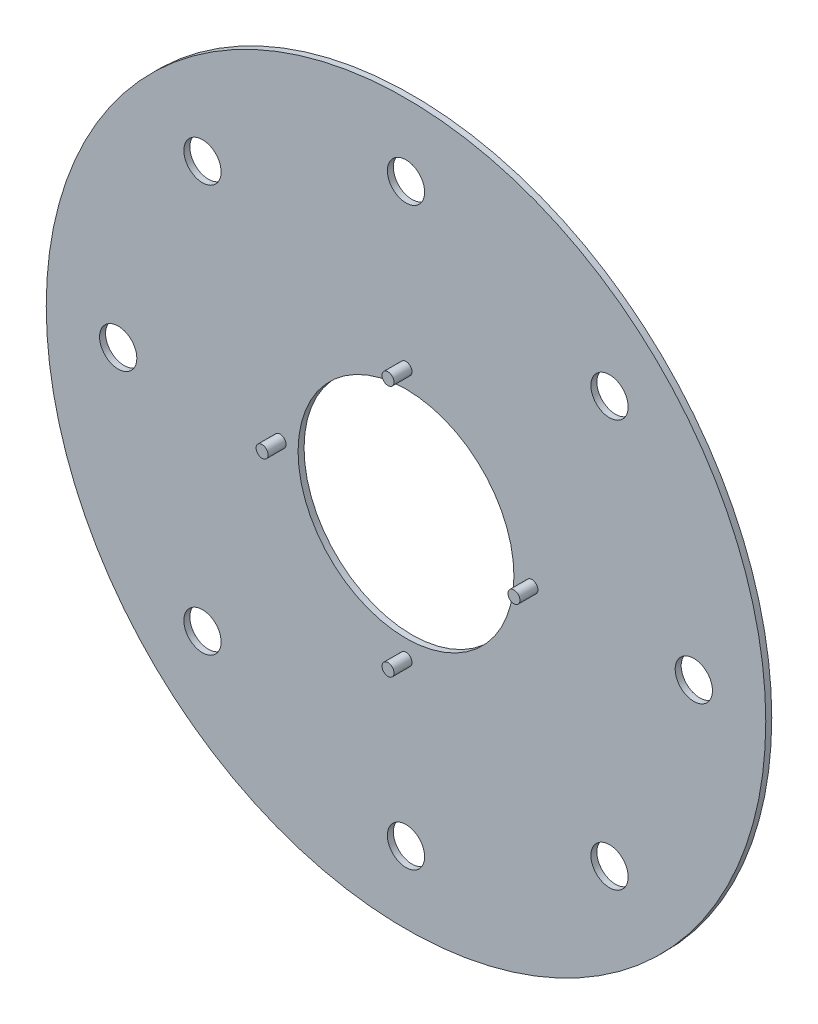
ISO-10303-21;
HEADER;
FILE_DESCRIPTION(('STEP AP214'),'2;1');
FILE_NAME('part.step','',(''),(''),'','','');
FILE_SCHEMA(('AUTOMOTIVE_DESIGN { 1 0 10303 214 1 1 1 1 }'));
ENDSEC;
DATA;
#1=APPLICATION_CONTEXT('core data for automotive mechanical design processes');
#2=APPLICATION_PROTOCOL_DEFINITION('international standard','automotive_design',2000,#1);
#3=PRODUCT_CONTEXT('',#1,'mechanical');
#4=PRODUCT('Part','Part','',(#3));
#5=PRODUCT_RELATED_PRODUCT_CATEGORY('part','',(#4));
#6=PRODUCT_DEFINITION_FORMATION('','',#4);
#7=PRODUCT_DEFINITION_CONTEXT('part definition',#1,'design');
#8=PRODUCT_DEFINITION('design','',#6,#7);
#9=PRODUCT_DEFINITION_SHAPE('','',#8);
#10=(LENGTH_UNIT() NAMED_UNIT(*) SI_UNIT(.MILLI.,.METRE.));
#11=(NAMED_UNIT(*) PLANE_ANGLE_UNIT() SI_UNIT($,.RADIAN.));
#12=(NAMED_UNIT(*) SI_UNIT($,.STERADIAN.) SOLID_ANGLE_UNIT());
#13=UNCERTAINTY_MEASURE_WITH_UNIT(LENGTH_MEASURE(1.E-05),#10,'distance_accuracy_value','');
#14=(GEOMETRIC_REPRESENTATION_CONTEXT(3) GLOBAL_UNCERTAINTY_ASSIGNED_CONTEXT((#13)) GLOBAL_UNIT_ASSIGNED_CONTEXT((#10,
#11,#12)) REPRESENTATION_CONTEXT('',''));
#15=CARTESIAN_POINT('',(0.,0.,0.));
#16=DIRECTION('',(0.,0.,1.));
#17=DIRECTION('',(1.,0.,0.));
#18=AXIS2_PLACEMENT_3D('',#15,#16,#17);
#19=CARTESIAN_POINT('',(0.,0.,1.));
#20=DIRECTION('',(0.,0.,1.));
#21=DIRECTION('',(1.,0.,0.));
#22=AXIS2_PLACEMENT_3D('',#19,#20,#21);
#23=PLANE('',#22);
#24=CARTESIAN_POINT('',(0.,0.,1.));
#25=DIRECTION('',(0.,0.,1.));
#26=DIRECTION('',(1.,0.,0.));
#27=AXIS2_PLACEMENT_3D('',#24,#25,#26);
#28=CIRCLE('',#27,18.);
#29=CARTESIAN_POINT('',(18.,0.,1.));
#30=VERTEX_POINT('',#29);
#31=EDGE_CURVE('E152',#30,#30,#28,.T.);
#32=ORIENTED_EDGE('',*,*,#31,.F.);
#33=EDGE_LOOP('',(#32));
#34=FACE_BOUND('',#33,.T.);
#35=CARTESIAN_POINT('',(-20.9999999999994,-5.95570018899379E-13,1.));
#36=DIRECTION('',(0.,0.,1.));
#37=DIRECTION('',(1.,0.,0.));
#38=AXIS2_PLACEMENT_3D('',#35,#36,#37);
#39=CIRCLE('',#38,1.00000000000095);
#40=CARTESIAN_POINT('',(-19.9999999999985,-5.95570018899379E-13,1.));
#41=VERTEX_POINT('',#40);
#42=EDGE_CURVE('E141',#41,#41,#39,.T.);
#43=ORIENTED_EDGE('',*,*,#42,.F.);
#44=EDGE_LOOP('',(#43));
#45=FACE_BOUND('',#44,.T.);
#46=CARTESIAN_POINT('',(1.18599652124234E-12,-21.,1.));
#47=DIRECTION('',(0.,0.,1.));
#48=DIRECTION('',(1.,0.,0.));
#49=AXIS2_PLACEMENT_3D('',#46,#47,#48);
#50=CIRCLE('',#49,1.00000000000127);
#51=CARTESIAN_POINT('',(1.00000000000246,-21.,1.));
#52=VERTEX_POINT('',#51);
#53=EDGE_CURVE('E133',#52,#52,#50,.T.);
#54=ORIENTED_EDGE('',*,*,#53,.F.);
#55=EDGE_LOOP('',(#54));
#56=FACE_BOUND('',#55,.T.);
#57=CARTESIAN_POINT('',(21.0000000000006,5.9299826062117E-13,1.));
#58=DIRECTION('',(0.,0.,1.));
#59=DIRECTION('',(1.,0.,0.));
#60=AXIS2_PLACEMENT_3D('',#57,#58,#59);
#61=CIRCLE('',#60,1.00000000000047);
#62=CARTESIAN_POINT('',(22.0000000000011,5.9299826062117E-13,1.));
#63=VERTEX_POINT('',#62);
#64=EDGE_CURVE('E125',#63,#63,#61,.T.);
#65=ORIENTED_EDGE('',*,*,#64,.F.);
#66=EDGE_LOOP('',(#65));
#67=FACE_BOUND('',#66,.T.);
#68=CARTESIAN_POINT('',(0.,21.,1.));
#69=DIRECTION('',(0.,0.,1.));
#70=DIRECTION('',(1.,0.,0.));
#71=AXIS2_PLACEMENT_3D('',#68,#69,#70);
#72=CIRCLE('',#71,1.);
#73=CARTESIAN_POINT('',(1.,21.,1.));
#74=VERTEX_POINT('',#73);
#75=EDGE_CURVE('E121',#74,#74,#72,.T.);
#76=ORIENTED_EDGE('',*,*,#75,.F.);
#77=EDGE_LOOP('',(#76));
#78=FACE_BOUND('',#77,.T.);
#79=CARTESIAN_POINT('',(-47.999999999998,-2.04342392667114E-12,1.));
#80=DIRECTION('',(0.,0.,1.));
#81=DIRECTION('',(1.,0.,0.));
#82=AXIS2_PLACEMENT_3D('',#79,#80,#81);
#83=CIRCLE('',#82,3.10719487491723);
#84=CARTESIAN_POINT('',(-44.8928051250807,-2.04342392667114E-12,1.));
#85=VERTEX_POINT('',#84);
#86=EDGE_CURVE('E101',#85,#85,#83,.T.);
#87=ORIENTED_EDGE('',*,*,#86,.F.);
#88=EDGE_LOOP('',(#87));
#89=FACE_BOUND('',#88,.T.);
#90=CARTESIAN_POINT('',(4.07509124407046E-12,-48.,1.));
#91=DIRECTION('',(0.,0.,1.));
#92=DIRECTION('',(1.,0.,0.));
#93=AXIS2_PLACEMENT_3D('',#90,#91,#92);
#94=CIRCLE('',#93,3.10719487491842);
#95=CARTESIAN_POINT('',(3.10719487492249,-48.,1.));
#96=VERTEX_POINT('',#95);
#97=EDGE_CURVE('E85',#96,#96,#94,.T.);
#98=ORIENTED_EDGE('',*,*,#97,.F.);
#99=EDGE_LOOP('',(#98));
#100=FACE_BOUND('',#99,.T.);
#101=CARTESIAN_POINT('',(48.000000000002,2.03754562203523E-12,1.));
#102=DIRECTION('',(0.,0.,1.));
#103=DIRECTION('',(1.,0.,0.));
#104=AXIS2_PLACEMENT_3D('',#101,#102,#103);
#105=CIRCLE('',#104,3.10719487491572);
#106=CARTESIAN_POINT('',(51.1071948749178,2.03754562203523E-12,1.));
#107=VERTEX_POINT('',#106);
#108=EDGE_CURVE('E69',#107,#107,#105,.T.);
#109=ORIENTED_EDGE('',*,*,#108,.F.);
#110=EDGE_LOOP('',(#109));
#111=FACE_BOUND('',#110,.T.);
#112=CARTESIAN_POINT('',(0.,48.,1.));
#113=DIRECTION('',(0.,0.,1.));
#114=DIRECTION('',(1.,0.,0.));
#115=AXIS2_PLACEMENT_3D('',#112,#113,#114);
#116=CIRCLE('',#115,3.1071948749142);
#117=CARTESIAN_POINT('',(3.1071948749142,48.,1.));
#118=VERTEX_POINT('',#117);
#119=EDGE_CURVE('E55',#118,#118,#116,.T.);
#120=ORIENTED_EDGE('',*,*,#119,.F.);
#121=EDGE_LOOP('',(#120));
#122=FACE_BOUND('',#121,.T.);
#123=CARTESIAN_POINT('',(0.,0.,1.));
#124=DIRECTION('',(0.,0.,1.));
#125=DIRECTION('',(1.,0.,0.));
#126=AXIS2_PLACEMENT_3D('',#123,#124,#125);
#127=CIRCLE('',#126,60.);
#128=CARTESIAN_POINT('',(60.,0.,1.));
#129=VERTEX_POINT('',#128);
#130=EDGE_CURVE('E10',#129,#129,#127,.T.);
#131=ORIENTED_EDGE('',*,*,#130,.T.);
#132=EDGE_LOOP('',(#131));
#133=FACE_BOUND('',#132,.T.);
#134=CARTESIAN_POINT('',(33.9411254969549,33.9411254969557,1.));
#135=DIRECTION('',(0.,0.,1.));
#136=DIRECTION('',(1.,0.,0.));
#137=AXIS2_PLACEMENT_3D('',#134,#135,#136);
#138=CIRCLE('',#137,3.10719487491444);
#139=CARTESIAN_POINT('',(37.0483203718693,33.9411254969557,1.));
#140=VERTEX_POINT('',#139);
#141=EDGE_CURVE('E61',#140,#140,#138,.T.);
#142=ORIENTED_EDGE('',*,*,#141,.F.);
#143=EDGE_LOOP('',(#142));
#144=FACE_BOUND('',#143,.T.);
#145=CARTESIAN_POINT('',(33.9411254969578,-33.9411254969528,1.));
#146=DIRECTION('',(0.,0.,1.));
#147=DIRECTION('',(1.,0.,0.));
#148=AXIS2_PLACEMENT_3D('',#145,#146,#147);
#149=CIRCLE('',#148,3.10719487491734);
#150=CARTESIAN_POINT('',(37.0483203718751,-33.9411254969528,1.));
#151=VERTEX_POINT('',#150);
#152=EDGE_CURVE('E77',#151,#151,#149,.T.);
#153=ORIENTED_EDGE('',*,*,#152,.F.);
#154=EDGE_LOOP('',(#153));
#155=FACE_BOUND('',#154,.T.);
#156=CARTESIAN_POINT('',(-33.9411254969508,-33.9411254969557,1.));
#157=DIRECTION('',(0.,0.,1.));
#158=DIRECTION('',(1.,0.,0.));
#159=AXIS2_PLACEMENT_3D('',#156,#157,#158);
#160=CIRCLE('',#159,3.10719487491836);
#161=CARTESIAN_POINT('',(-30.8339306220324,-33.9411254969557,1.));
#162=VERTEX_POINT('',#161);
#163=EDGE_CURVE('E93',#162,#162,#160,.T.);
#164=ORIENTED_EDGE('',*,*,#163,.F.);
#165=EDGE_LOOP('',(#164));
#166=FACE_BOUND('',#165,.T.);
#167=CARTESIAN_POINT('',(-33.9411254969537,33.9411254969528,1.));
#168=DIRECTION('',(0.,0.,1.));
#169=DIRECTION('',(1.,0.,0.));
#170=AXIS2_PLACEMENT_3D('',#167,#168,#169);
#171=CIRCLE('',#170,3.10719487491576);
#172=CARTESIAN_POINT('',(-30.8339306220379,33.9411254969528,1.));
#173=VERTEX_POINT('',#172);
#174=EDGE_CURVE('E109',#173,#173,#171,.T.);
#175=ORIENTED_EDGE('',*,*,#174,.F.);
#176=EDGE_LOOP('',(#175));
#177=FACE_BOUND('',#176,.T.);
#178=ADVANCED_FACE('F40',(#34,#45,#56,#67,#78,#89,#100,#111,#122,#133,#144,#155,#166,#177),#23,.T.);
#179=CARTESIAN_POINT('',(0.,0.,0.));
#180=DIRECTION('',(0.,0.,1.));
#181=DIRECTION('',(1.,0.,0.));
#182=AXIS2_PLACEMENT_3D('',#179,#180,#181);
#183=PLANE('',#182);
#184=CARTESIAN_POINT('',(0.,0.,0.));
#185=DIRECTION('',(0.,0.,1.));
#186=DIRECTION('',(1.,0.,0.));
#187=AXIS2_PLACEMENT_3D('',#184,#185,#186);
#188=CIRCLE('',#187,18.);
#189=CARTESIAN_POINT('',(18.,0.,0.));
#190=VERTEX_POINT('',#189);
#191=EDGE_CURVE('E44',#190,#190,#188,.T.);
#192=ORIENTED_EDGE('',*,*,#191,.T.);
#193=EDGE_LOOP('',(#192));
#194=FACE_BOUND('',#193,.T.);
#195=CARTESIAN_POINT('',(0.,0.,0.));
#196=DIRECTION('',(0.,0.,1.));
#197=DIRECTION('',(1.,0.,0.));
#198=AXIS2_PLACEMENT_3D('',#195,#196,#197);
#199=CIRCLE('',#198,60.);
#200=CARTESIAN_POINT('',(60.,0.,0.));
#201=VERTEX_POINT('',#200);
#202=EDGE_CURVE('E49',#201,#201,#199,.T.);
#203=ORIENTED_EDGE('',*,*,#202,.F.);
#204=EDGE_LOOP('',(#203));
#205=FACE_BOUND('',#204,.T.);
#206=CARTESIAN_POINT('',(0.,48.,0.));
#207=DIRECTION('',(0.,0.,1.));
#208=DIRECTION('',(1.,0.,0.));
#209=AXIS2_PLACEMENT_3D('',#206,#207,#208);
#210=CIRCLE('',#209,3.1071948749142);
#211=CARTESIAN_POINT('',(3.1071948749142,48.,0.));
#212=VERTEX_POINT('',#211);
#213=EDGE_CURVE('E57',#212,#212,#210,.T.);
#214=ORIENTED_EDGE('',*,*,#213,.T.);
#215=EDGE_LOOP('',(#214));
#216=FACE_BOUND('',#215,.T.);
#217=CARTESIAN_POINT('',(33.9411254969549,33.9411254969557,0.));
#218=DIRECTION('',(0.,0.,1.));
#219=DIRECTION('',(1.,0.,0.));
#220=AXIS2_PLACEMENT_3D('',#217,#218,#219);
#221=CIRCLE('',#220,3.10719487491444);
#222=CARTESIAN_POINT('',(37.0483203718693,33.9411254969557,0.));
#223=VERTEX_POINT('',#222);
#224=EDGE_CURVE('E65',#223,#223,#221,.T.);
#225=ORIENTED_EDGE('',*,*,#224,.T.);
#226=EDGE_LOOP('',(#225));
#227=FACE_BOUND('',#226,.T.);
#228=CARTESIAN_POINT('',(48.000000000002,2.03754562203523E-12,0.));
#229=DIRECTION('',(0.,0.,1.));
#230=DIRECTION('',(1.,0.,0.));
#231=AXIS2_PLACEMENT_3D('',#228,#229,#230);
#232=CIRCLE('',#231,3.10719487491572);
#233=CARTESIAN_POINT('',(51.1071948749178,2.03754562203523E-12,0.));
#234=VERTEX_POINT('',#233);
#235=EDGE_CURVE('E73',#234,#234,#232,.T.);
#236=ORIENTED_EDGE('',*,*,#235,.T.);
#237=EDGE_LOOP('',(#236));
#238=FACE_BOUND('',#237,.T.);
#239=CARTESIAN_POINT('',(33.9411254969578,-33.9411254969528,0.));
#240=DIRECTION('',(0.,0.,1.));
#241=DIRECTION('',(1.,0.,0.));
#242=AXIS2_PLACEMENT_3D('',#239,#240,#241);
#243=CIRCLE('',#242,3.10719487491734);
#244=CARTESIAN_POINT('',(37.0483203718751,-33.9411254969528,0.));
#245=VERTEX_POINT('',#244);
#246=EDGE_CURVE('E81',#245,#245,#243,.T.);
#247=ORIENTED_EDGE('',*,*,#246,.T.);
#248=EDGE_LOOP('',(#247));
#249=FACE_BOUND('',#248,.T.);
#250=CARTESIAN_POINT('',(4.07509124407046E-12,-48.,0.));
#251=DIRECTION('',(0.,0.,1.));
#252=DIRECTION('',(1.,0.,0.));
#253=AXIS2_PLACEMENT_3D('',#250,#251,#252);
#254=CIRCLE('',#253,3.10719487491842);
#255=CARTESIAN_POINT('',(3.10719487492249,-48.,0.));
#256=VERTEX_POINT('',#255);
#257=EDGE_CURVE('E89',#256,#256,#254,.T.);
#258=ORIENTED_EDGE('',*,*,#257,.T.);
#259=EDGE_LOOP('',(#258));
#260=FACE_BOUND('',#259,.T.);
#261=CARTESIAN_POINT('',(-33.9411254969508,-33.9411254969557,0.));
#262=DIRECTION('',(0.,0.,1.));
#263=DIRECTION('',(1.,0.,0.));
#264=AXIS2_PLACEMENT_3D('',#261,#262,#263);
#265=CIRCLE('',#264,3.10719487491836);
#266=CARTESIAN_POINT('',(-30.8339306220324,-33.9411254969557,0.));
#267=VERTEX_POINT('',#266);
#268=EDGE_CURVE('E97',#267,#267,#265,.T.);
#269=ORIENTED_EDGE('',*,*,#268,.T.);
#270=EDGE_LOOP('',(#269));
#271=FACE_BOUND('',#270,.T.);
#272=CARTESIAN_POINT('',(-47.999999999998,-2.04342392667114E-12,0.));
#273=DIRECTION('',(0.,0.,1.));
#274=DIRECTION('',(1.,0.,0.));
#275=AXIS2_PLACEMENT_3D('',#272,#273,#274);
#276=CIRCLE('',#275,3.10719487491723);
#277=CARTESIAN_POINT('',(-44.8928051250807,-2.04342392667114E-12,0.));
#278=VERTEX_POINT('',#277);
#279=EDGE_CURVE('E105',#278,#278,#276,.T.);
#280=ORIENTED_EDGE('',*,*,#279,.T.);
#281=EDGE_LOOP('',(#280));
#282=FACE_BOUND('',#281,.T.);
#283=CARTESIAN_POINT('',(-33.9411254969537,33.9411254969528,0.));
#284=DIRECTION('',(0.,0.,1.));
#285=DIRECTION('',(1.,0.,0.));
#286=AXIS2_PLACEMENT_3D('',#283,#284,#285);
#287=CIRCLE('',#286,3.10719487491576);
#288=CARTESIAN_POINT('',(-30.8339306220379,33.9411254969528,0.));
#289=VERTEX_POINT('',#288);
#290=EDGE_CURVE('E113',#289,#289,#287,.T.);
#291=ORIENTED_EDGE('',*,*,#290,.T.);
#292=EDGE_LOOP('',(#291));
#293=FACE_BOUND('',#292,.T.);
#294=ADVANCED_FACE('F161',(#194,#205,#216,#227,#238,#249,#260,#271,#282,#293),#183,.F.);
#295=CARTESIAN_POINT('',(0.,0.,1.));
#296=DIRECTION('',(0.,0.,-1.));
#297=DIRECTION('',(-1.,0.,0.));
#298=AXIS2_PLACEMENT_3D('',#295,#296,#297);
#299=CYLINDRICAL_SURFACE('',#298,60.);
#300=ORIENTED_EDGE('',*,*,#130,.F.);
#301=EDGE_LOOP('',(#300));
#302=FACE_BOUND('',#301,.T.);
#303=ORIENTED_EDGE('',*,*,#202,.T.);
#304=EDGE_LOOP('',(#303));
#305=FACE_BOUND('',#304,.T.);
#306=ADVANCED_FACE('F42',(#302,#305),#299,.T.);
#307=CARTESIAN_POINT('',(0.,48.,1.));
#308=DIRECTION('',(0.,0.,-1.));
#309=DIRECTION('',(-1.,0.,0.));
#310=AXIS2_PLACEMENT_3D('',#307,#308,#309);
#311=CYLINDRICAL_SURFACE('',#310,3.1071948749142);
#312=ORIENTED_EDGE('',*,*,#119,.T.);
#313=EDGE_LOOP('',(#312));
#314=FACE_BOUND('',#313,.T.);
#315=ORIENTED_EDGE('',*,*,#213,.F.);
#316=EDGE_LOOP('',(#315));
#317=FACE_BOUND('',#316,.T.);
#318=ADVANCED_FACE('F184',(#314,#317),#311,.F.);
#319=CARTESIAN_POINT('',(33.9411254969549,33.9411254969557,1.));
#320=DIRECTION('',(0.,0.,-1.));
#321=DIRECTION('',(-1.,0.,0.));
#322=AXIS2_PLACEMENT_3D('',#319,#320,#321);
#323=CYLINDRICAL_SURFACE('',#322,3.10719487491444);
#324=ORIENTED_EDGE('',*,*,#141,.T.);
#325=EDGE_LOOP('',(#324));
#326=FACE_BOUND('',#325,.T.);
#327=ORIENTED_EDGE('',*,*,#224,.F.);
#328=EDGE_LOOP('',(#327));
#329=FACE_BOUND('',#328,.T.);
#330=ADVANCED_FACE('F187',(#326,#329),#323,.F.);
#331=CARTESIAN_POINT('',(48.000000000002,2.03754562203523E-12,1.));
#332=DIRECTION('',(0.,0.,-1.));
#333=DIRECTION('',(-1.,0.,0.));
#334=AXIS2_PLACEMENT_3D('',#331,#332,#333);
#335=CYLINDRICAL_SURFACE('',#334,3.10719487491572);
#336=ORIENTED_EDGE('',*,*,#108,.T.);
#337=EDGE_LOOP('',(#336));
#338=FACE_BOUND('',#337,.T.);
#339=ORIENTED_EDGE('',*,*,#235,.F.);
#340=EDGE_LOOP('',(#339));
#341=FACE_BOUND('',#340,.T.);
#342=ADVANCED_FACE('F191',(#338,#341),#335,.F.);
#343=CARTESIAN_POINT('',(33.9411254969578,-33.9411254969528,1.));
#344=DIRECTION('',(0.,0.,-1.));
#345=DIRECTION('',(-1.,0.,0.));
#346=AXIS2_PLACEMENT_3D('',#343,#344,#345);
#347=CYLINDRICAL_SURFACE('',#346,3.10719487491734);
#348=ORIENTED_EDGE('',*,*,#152,.T.);
#349=EDGE_LOOP('',(#348));
#350=FACE_BOUND('',#349,.T.);
#351=ORIENTED_EDGE('',*,*,#246,.F.);
#352=EDGE_LOOP('',(#351));
#353=FACE_BOUND('',#352,.T.);
#354=ADVANCED_FACE('F195',(#350,#353),#347,.F.);
#355=CARTESIAN_POINT('',(4.07509124407046E-12,-48.,1.));
#356=DIRECTION('',(0.,0.,-1.));
#357=DIRECTION('',(-1.,0.,0.));
#358=AXIS2_PLACEMENT_3D('',#355,#356,#357);
#359=CYLINDRICAL_SURFACE('',#358,3.10719487491842);
#360=ORIENTED_EDGE('',*,*,#97,.T.);
#361=EDGE_LOOP('',(#360));
#362=FACE_BOUND('',#361,.T.);
#363=ORIENTED_EDGE('',*,*,#257,.F.);
#364=EDGE_LOOP('',(#363));
#365=FACE_BOUND('',#364,.T.);
#366=ADVANCED_FACE('F199',(#362,#365),#359,.F.);
#367=CARTESIAN_POINT('',(-33.9411254969508,-33.9411254969557,1.));
#368=DIRECTION('',(0.,0.,-1.));
#369=DIRECTION('',(-1.,0.,0.));
#370=AXIS2_PLACEMENT_3D('',#367,#368,#369);
#371=CYLINDRICAL_SURFACE('',#370,3.10719487491836);
#372=ORIENTED_EDGE('',*,*,#163,.T.);
#373=EDGE_LOOP('',(#372));
#374=FACE_BOUND('',#373,.T.);
#375=ORIENTED_EDGE('',*,*,#268,.F.);
#376=EDGE_LOOP('',(#375));
#377=FACE_BOUND('',#376,.T.);
#378=ADVANCED_FACE('F203',(#374,#377),#371,.F.);
#379=CARTESIAN_POINT('',(-47.999999999998,-2.04342392667114E-12,1.));
#380=DIRECTION('',(0.,0.,-1.));
#381=DIRECTION('',(-1.,0.,0.));
#382=AXIS2_PLACEMENT_3D('',#379,#380,#381);
#383=CYLINDRICAL_SURFACE('',#382,3.10719487491723);
#384=ORIENTED_EDGE('',*,*,#86,.T.);
#385=EDGE_LOOP('',(#384));
#386=FACE_BOUND('',#385,.T.);
#387=ORIENTED_EDGE('',*,*,#279,.F.);
#388=EDGE_LOOP('',(#387));
#389=FACE_BOUND('',#388,.T.);
#390=ADVANCED_FACE('F207',(#386,#389),#383,.F.);
#391=CARTESIAN_POINT('',(-33.9411254969537,33.9411254969528,1.));
#392=DIRECTION('',(0.,0.,-1.));
#393=DIRECTION('',(-1.,0.,0.));
#394=AXIS2_PLACEMENT_3D('',#391,#392,#393);
#395=CYLINDRICAL_SURFACE('',#394,3.10719487491576);
#396=ORIENTED_EDGE('',*,*,#174,.T.);
#397=EDGE_LOOP('',(#396));
#398=FACE_BOUND('',#397,.T.);
#399=ORIENTED_EDGE('',*,*,#290,.F.);
#400=EDGE_LOOP('',(#399));
#401=FACE_BOUND('',#400,.T.);
#402=ADVANCED_FACE('F211',(#398,#401),#395,.F.);
#403=CARTESIAN_POINT('',(0.,21.,4.));
#404=DIRECTION('',(0.,0.,-1.));
#405=DIRECTION('',(-1.,0.,0.));
#406=AXIS2_PLACEMENT_3D('',#403,#404,#405);
#407=CYLINDRICAL_SURFACE('',#406,1.);
#408=CARTESIAN_POINT('',(0.,21.,4.));
#409=DIRECTION('',(0.,0.,1.));
#410=DIRECTION('',(1.,0.,0.));
#411=AXIS2_PLACEMENT_3D('',#408,#409,#410);
#412=CIRCLE('',#411,1.);
#413=CARTESIAN_POINT('',(1.,21.,4.));
#414=VERTEX_POINT('',#413);
#415=EDGE_CURVE('E117',#414,#414,#412,.T.);
#416=ORIENTED_EDGE('',*,*,#415,.F.);
#417=EDGE_LOOP('',(#416));
#418=FACE_BOUND('',#417,.T.);
#419=ORIENTED_EDGE('',*,*,#75,.T.);
#420=EDGE_LOOP('',(#419));
#421=FACE_BOUND('',#420,.T.);
#422=ADVANCED_FACE('F215',(#418,#421),#407,.T.);
#423=CARTESIAN_POINT('',(0.,21.,4.));
#424=DIRECTION('',(0.,0.,1.));
#425=DIRECTION('',(1.,0.,0.));
#426=AXIS2_PLACEMENT_3D('',#423,#424,#425);
#427=PLANE('',#426);
#428=ORIENTED_EDGE('',*,*,#415,.T.);
#429=EDGE_LOOP('',(#428));
#430=FACE_BOUND('',#429,.T.);
#431=ADVANCED_FACE('F219',(#430),#427,.T.);
#432=CARTESIAN_POINT('',(21.0000000000006,5.9299826062117E-13,4.));
#433=DIRECTION('',(0.,0.,-1.));
#434=DIRECTION('',(-1.,0.,0.));
#435=AXIS2_PLACEMENT_3D('',#432,#433,#434);
#436=CYLINDRICAL_SURFACE('',#435,1.00000000000047);
#437=CARTESIAN_POINT('',(21.0000000000006,5.9299826062117E-13,4.));
#438=DIRECTION('',(0.,0.,1.));
#439=DIRECTION('',(1.,0.,0.));
#440=AXIS2_PLACEMENT_3D('',#437,#438,#439);
#441=CIRCLE('',#440,1.00000000000047);
#442=CARTESIAN_POINT('',(22.0000000000011,5.9299826062117E-13,4.));
#443=VERTEX_POINT('',#442);
#444=EDGE_CURVE('E129',#443,#443,#441,.T.);
#445=ORIENTED_EDGE('',*,*,#444,.F.);
#446=EDGE_LOOP('',(#445));
#447=FACE_BOUND('',#446,.T.);
#448=ORIENTED_EDGE('',*,*,#64,.T.);
#449=EDGE_LOOP('',(#448));
#450=FACE_BOUND('',#449,.T.);
#451=ADVANCED_FACE('F223',(#447,#450),#436,.T.);
#452=CARTESIAN_POINT('',(21.0000000000006,5.9299826062117E-13,4.));
#453=DIRECTION('',(0.,0.,1.));
#454=DIRECTION('',(1.,0.,0.));
#455=AXIS2_PLACEMENT_3D('',#452,#453,#454);
#456=PLANE('',#455);
#457=ORIENTED_EDGE('',*,*,#444,.T.);
#458=EDGE_LOOP('',(#457));
#459=FACE_BOUND('',#458,.T.);
#460=ADVANCED_FACE('F225',(#459),#456,.T.);
#461=CARTESIAN_POINT('',(1.18599652124234E-12,-21.,4.));
#462=DIRECTION('',(0.,0.,-1.));
#463=DIRECTION('',(-1.,0.,0.));
#464=AXIS2_PLACEMENT_3D('',#461,#462,#463);
#465=CYLINDRICAL_SURFACE('',#464,1.00000000000127);
#466=CARTESIAN_POINT('',(1.18599652124234E-12,-21.,4.));
#467=DIRECTION('',(0.,0.,1.));
#468=DIRECTION('',(1.,0.,0.));
#469=AXIS2_PLACEMENT_3D('',#466,#467,#468);
#470=CIRCLE('',#469,1.00000000000127);
#471=CARTESIAN_POINT('',(1.00000000000246,-21.,4.));
#472=VERTEX_POINT('',#471);
#473=EDGE_CURVE('E137',#472,#472,#470,.T.);
#474=ORIENTED_EDGE('',*,*,#473,.F.);
#475=EDGE_LOOP('',(#474));
#476=FACE_BOUND('',#475,.T.);
#477=ORIENTED_EDGE('',*,*,#53,.T.);
#478=EDGE_LOOP('',(#477));
#479=FACE_BOUND('',#478,.T.);
#480=ADVANCED_FACE('F228',(#476,#479),#465,.T.);
#481=CARTESIAN_POINT('',(1.18599652124234E-12,-21.,4.));
#482=DIRECTION('',(0.,0.,1.));
#483=DIRECTION('',(1.,0.,0.));
#484=AXIS2_PLACEMENT_3D('',#481,#482,#483);
#485=PLANE('',#484);
#486=ORIENTED_EDGE('',*,*,#473,.T.);
#487=EDGE_LOOP('',(#486));
#488=FACE_BOUND('',#487,.T.);
#489=ADVANCED_FACE('F233',(#488),#485,.T.);
#490=CARTESIAN_POINT('',(-20.9999999999994,-5.95570018899379E-13,4.));
#491=DIRECTION('',(0.,0.,-1.));
#492=DIRECTION('',(-1.,0.,0.));
#493=AXIS2_PLACEMENT_3D('',#490,#491,#492);
#494=CYLINDRICAL_SURFACE('',#493,1.00000000000095);
#495=CARTESIAN_POINT('',(-20.9999999999994,-5.95570018899379E-13,4.));
#496=DIRECTION('',(0.,0.,1.));
#497=DIRECTION('',(1.,0.,0.));
#498=AXIS2_PLACEMENT_3D('',#495,#496,#497);
#499=CIRCLE('',#498,1.00000000000095);
#500=CARTESIAN_POINT('',(-19.9999999999985,-5.95570018899379E-13,4.));
#501=VERTEX_POINT('',#500);
#502=EDGE_CURVE('E145',#501,#501,#499,.T.);
#503=ORIENTED_EDGE('',*,*,#502,.F.);
#504=EDGE_LOOP('',(#503));
#505=FACE_BOUND('',#504,.T.);
#506=ORIENTED_EDGE('',*,*,#42,.T.);
#507=EDGE_LOOP('',(#506));
#508=FACE_BOUND('',#507,.T.);
#509=ADVANCED_FACE('F171',(#505,#508),#494,.T.);
#510=CARTESIAN_POINT('',(-20.9999999999994,-5.95570018899379E-13,4.));
#511=DIRECTION('',(0.,0.,1.));
#512=DIRECTION('',(1.,0.,0.));
#513=AXIS2_PLACEMENT_3D('',#510,#511,#512);
#514=PLANE('',#513);
#515=ORIENTED_EDGE('',*,*,#502,.T.);
#516=EDGE_LOOP('',(#515));
#517=FACE_BOUND('',#516,.T.);
#518=ADVANCED_FACE('F166',(#517),#514,.T.);
#519=CARTESIAN_POINT('',(0.,0.,-2.));
#520=DIRECTION('',(0.,0.,1.));
#521=DIRECTION('',(1.,0.,0.));
#522=AXIS2_PLACEMENT_3D('',#519,#520,#521);
#523=CYLINDRICAL_SURFACE('',#522,18.);
#524=ORIENTED_EDGE('',*,*,#31,.T.);
#525=EDGE_LOOP('',(#524));
#526=FACE_BOUND('',#525,.T.);
#527=ORIENTED_EDGE('',*,*,#191,.F.);
#528=EDGE_LOOP('',(#527));
#529=FACE_BOUND('',#528,.T.);
#530=ADVANCED_FACE('F164',(#526,#529),#523,.F.);
#531=CLOSED_SHELL('',(#178,#294,#306,#318,#330,#342,#354,#366,#378,#390,#402,#422,#431,#451,
#460,#480,#489,#509,#518,#530));
#532=MANIFOLD_SOLID_BREP('B2',#531);
#533=ADVANCED_BREP_SHAPE_REPRESENTATION('',(#18,#532),#14);
#534=SHAPE_DEFINITION_REPRESENTATION(#9,#533);
ENDSEC;
END-ISO-10303-21;
